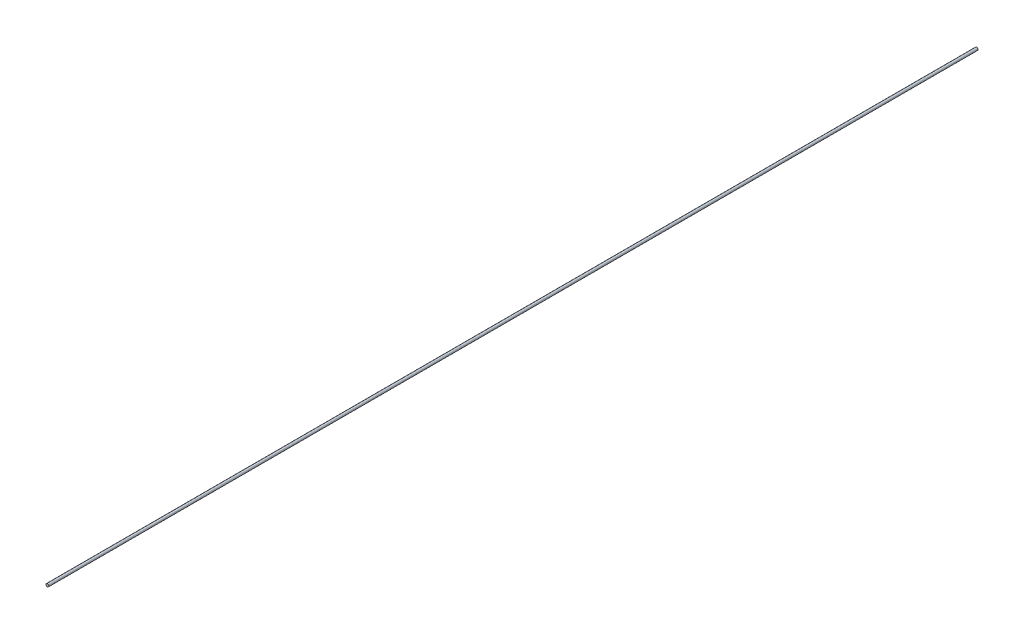
ISO-10303-21;
HEADER;
FILE_DESCRIPTION(('STEP AP214'),'2;1');
FILE_NAME('part.step','',(''),(''),'','','');
FILE_SCHEMA(('AUTOMOTIVE_DESIGN { 1 0 10303 214 1 1 1 1 }'));
ENDSEC;
DATA;
#1=APPLICATION_CONTEXT('core data for automotive mechanical design processes');
#2=APPLICATION_PROTOCOL_DEFINITION('international standard','automotive_design',2000,#1);
#3=PRODUCT_CONTEXT('',#1,'mechanical');
#4=PRODUCT('Part','Part','',(#3));
#5=PRODUCT_RELATED_PRODUCT_CATEGORY('part','',(#4));
#6=PRODUCT_DEFINITION_FORMATION('','',#4);
#7=PRODUCT_DEFINITION_CONTEXT('part definition',#1,'design');
#8=PRODUCT_DEFINITION('design','',#6,#7);
#9=PRODUCT_DEFINITION_SHAPE('','',#8);
#10=(LENGTH_UNIT() NAMED_UNIT(*) SI_UNIT(.MILLI.,.METRE.));
#11=(NAMED_UNIT(*) PLANE_ANGLE_UNIT() SI_UNIT($,.RADIAN.));
#12=(NAMED_UNIT(*) SI_UNIT($,.STERADIAN.) SOLID_ANGLE_UNIT());
#13=UNCERTAINTY_MEASURE_WITH_UNIT(LENGTH_MEASURE(1.E-05),#10,'distance_accuracy_value','');
#14=(GEOMETRIC_REPRESENTATION_CONTEXT(3) GLOBAL_UNCERTAINTY_ASSIGNED_CONTEXT((#13)) GLOBAL_UNIT_ASSIGNED_CONTEXT((#10,
#11,#12)) REPRESENTATION_CONTEXT('',''));
#15=CARTESIAN_POINT('',(0.,0.,0.));
#16=DIRECTION('',(0.,0.,1.));
#17=DIRECTION('',(1.,0.,0.));
#18=AXIS2_PLACEMENT_3D('',#15,#16,#17);
#19=CARTESIAN_POINT('',(0.,0.,1675.));
#20=DIRECTION('',(0.,0.,-1.));
#21=DIRECTION('',(-1.,0.,0.));
#22=AXIS2_PLACEMENT_3D('',#19,#20,#21);
#23=CYLINDRICAL_SURFACE('',#22,5.);
#24=CARTESIAN_POINT('',(0.,0.,1675.));
#25=DIRECTION('',(0.,0.,1.));
#26=DIRECTION('',(1.,0.,0.));
#27=AXIS2_PLACEMENT_3D('',#24,#25,#26);
#28=CIRCLE('',#27,5.);
#29=CARTESIAN_POINT('',(-5.,0.,1675.));
#30=VERTEX_POINT('',#29);
#31=EDGE_CURVE('E10',#30,#30,#28,.T.);
#32=CARTESIAN_POINT('',(0.,0.,-1675.));
#33=DIRECTION('',(0.,0.,1.));
#34=DIRECTION('',(1.,0.,0.));
#35=AXIS2_PLACEMENT_3D('',#32,#33,#34);
#36=CIRCLE('',#35,5.);
#37=CARTESIAN_POINT('',(-5.,0.,-1675.));
#38=VERTEX_POINT('',#37);
#39=EDGE_CURVE('E34',#38,#38,#36,.T.);
#40=CARTESIAN_POINT('',(-5.,0.,1675.));
#41=CARTESIAN_POINT('',(-5.,0.,1640.10416666667));
#42=CARTESIAN_POINT('',(-5.,0.,1605.20833333333));
#43=CARTESIAN_POINT('',(-5.,0.,1535.41666666667));
#44=CARTESIAN_POINT('',(-5.,0.,1500.52083333333));
#45=CARTESIAN_POINT('',(-5.,0.,1430.72916666667));
#46=CARTESIAN_POINT('',(-5.,0.,1395.83333333333));
#47=CARTESIAN_POINT('',(-5.,0.,1326.04166666667));
#48=CARTESIAN_POINT('',(-5.,0.,1291.14583333333));
#49=CARTESIAN_POINT('',(-5.,0.,1221.35416666667));
#50=CARTESIAN_POINT('',(-5.,0.,1186.45833333333));
#51=CARTESIAN_POINT('',(-5.,0.,1116.66666666667));
#52=CARTESIAN_POINT('',(-5.,0.,1081.77083333333));
#53=CARTESIAN_POINT('',(-5.,0.,1011.97916666667));
#54=CARTESIAN_POINT('',(-5.,0.,977.083333333333));
#55=CARTESIAN_POINT('',(-5.,0.,907.291666666667));
#56=CARTESIAN_POINT('',(-5.,0.,872.395833333333));
#57=CARTESIAN_POINT('',(-5.,0.,802.604166666667));
#58=CARTESIAN_POINT('',(-5.,0.,767.708333333333));
#59=CARTESIAN_POINT('',(-5.,0.,697.916666666667));
#60=CARTESIAN_POINT('',(-5.,0.,663.020833333333));
#61=CARTESIAN_POINT('',(-5.,0.,593.229166666667));
#62=CARTESIAN_POINT('',(-5.,0.,558.333333333333));
#63=CARTESIAN_POINT('',(-5.,0.,488.541666666667));
#64=CARTESIAN_POINT('',(-5.,0.,453.645833333333));
#65=CARTESIAN_POINT('',(-5.,0.,383.854166666667));
#66=CARTESIAN_POINT('',(-5.,0.,348.958333333333));
#67=CARTESIAN_POINT('',(-5.,0.,279.166666666667));
#68=CARTESIAN_POINT('',(-5.,0.,244.270833333333));
#69=CARTESIAN_POINT('',(-5.,0.,174.479166666667));
#70=CARTESIAN_POINT('',(-5.,0.,139.583333333333));
#71=CARTESIAN_POINT('',(-5.,0.,69.7916666666667));
#72=CARTESIAN_POINT('',(-5.,0.,34.8958333333333));
#73=CARTESIAN_POINT('',(-5.,0.,-34.8958333333333));
#74=CARTESIAN_POINT('',(-5.,0.,-69.7916666666667));
#75=CARTESIAN_POINT('',(-5.,0.,-139.583333333333));
#76=CARTESIAN_POINT('',(-5.,0.,-174.479166666667));
#77=CARTESIAN_POINT('',(-5.,0.,-244.270833333333));
#78=CARTESIAN_POINT('',(-5.,0.,-279.166666666667));
#79=CARTESIAN_POINT('',(-5.,0.,-348.958333333333));
#80=CARTESIAN_POINT('',(-5.,0.,-383.854166666667));
#81=CARTESIAN_POINT('',(-5.,0.,-453.645833333333));
#82=CARTESIAN_POINT('',(-5.,0.,-488.541666666666));
#83=CARTESIAN_POINT('',(-5.,0.,-558.333333333333));
#84=CARTESIAN_POINT('',(-5.,0.,-593.229166666667));
#85=CARTESIAN_POINT('',(-5.,0.,-663.020833333333));
#86=CARTESIAN_POINT('',(-5.,0.,-697.916666666667));
#87=CARTESIAN_POINT('',(-5.,0.,-767.708333333333));
#88=CARTESIAN_POINT('',(-5.,0.,-802.604166666666));
#89=CARTESIAN_POINT('',(-5.,0.,-872.395833333333));
#90=CARTESIAN_POINT('',(-5.,0.,-907.291666666667));
#91=CARTESIAN_POINT('',(-5.,0.,-977.083333333333));
#92=CARTESIAN_POINT('',(-5.,0.,-1011.97916666667));
#93=CARTESIAN_POINT('',(-5.,0.,-1081.77083333333));
#94=CARTESIAN_POINT('',(-5.,0.,-1116.66666666667));
#95=CARTESIAN_POINT('',(-5.,0.,-1186.45833333333));
#96=CARTESIAN_POINT('',(-5.,0.,-1221.35416666667));
#97=CARTESIAN_POINT('',(-5.,0.,-1291.14583333333));
#98=CARTESIAN_POINT('',(-5.,0.,-1326.04166666667));
#99=CARTESIAN_POINT('',(-5.,0.,-1395.83333333333));
#100=CARTESIAN_POINT('',(-5.,0.,-1430.72916666667));
#101=CARTESIAN_POINT('',(-5.,0.,-1500.52083333333));
#102=CARTESIAN_POINT('',(-5.,0.,-1535.41666666667));
#103=CARTESIAN_POINT('',(-5.,0.,-1605.20833333333));
#104=CARTESIAN_POINT('',(-5.,0.,-1640.10416666667));
#105=CARTESIAN_POINT('',(-5.,0.,-1675.));
#106=B_SPLINE_CURVE_WITH_KNOTS('',3,(#40,#41,#42,#43,#44,#45,#46,#47,#48,#49,#50,#51,#52,#53,
#54,#55,#56,#57,#58,#59,#60,#61,#62,#63,#64,#65,#66,#67,#68,#69,#70,#71,#72,#73,#74,#75,#76,#77,
#78,#79,#80,#81,#82,#83,#84,#85,#86,#87,#88,#89,#90,#91,#92,#93,#94,#95,#96,#97,#98,#99,#100,
#101,#102,#103,#104,#105),.UNSPECIFIED.,.F.,.F.,(4,2,2,2,2,2,2,2,2,2,2,2,2,2,2,2,2,2,2,2,2,2,2,
2,2,2,2,2,2,2,2,2,4),(0.,104.6875,209.375,314.0625,418.75,523.4375,628.125,732.8125,837.5,
942.1875,1046.875,1151.5625,1256.25,1360.9375,1465.625,1570.3125,1675.,1779.6875,1884.375,
1989.0625,2093.75,2198.4375,2303.125,2407.8125,2512.5,2617.1875,2721.875,2826.5625,2931.25,
3035.9375,3140.625,3245.3125,3350.),.UNSPECIFIED.);
#107=EDGE_CURVE('BSEAM31',#30,#38,#106,.T.);
#108=ORIENTED_EDGE('',*,*,#31,.F.);
#109=ORIENTED_EDGE('',*,*,#39,.T.);
#110=ORIENTED_EDGE('',*,*,#107,.T.);
#111=ORIENTED_EDGE('',*,*,#107,.F.);
#112=EDGE_LOOP('',(#108,#110,#109,#111));
#113=FACE_BOUND('',#112,.T.);
#114=ADVANCED_FACE('F31',(#113),#23,.T.);
#115=CARTESIAN_POINT('',(0.,0.,1675.));
#116=DIRECTION('',(0.,0.,1.));
#117=DIRECTION('',(1.,0.,0.));
#118=AXIS2_PLACEMENT_3D('',#115,#116,#117);
#119=PLANE('',#118);
#120=ORIENTED_EDGE('',*,*,#31,.T.);
#121=EDGE_LOOP('',(#120));
#122=FACE_BOUND('',#121,.T.);
#123=ADVANCED_FACE('F46',(#122),#119,.T.);
#124=CARTESIAN_POINT('',(0.,0.,-1675.));
#125=DIRECTION('',(0.,0.,1.));
#126=DIRECTION('',(1.,0.,0.));
#127=AXIS2_PLACEMENT_3D('',#124,#125,#126);
#128=PLANE('',#127);
#129=ORIENTED_EDGE('',*,*,#39,.F.);
#130=EDGE_LOOP('',(#129));
#131=FACE_BOUND('',#130,.T.);
#132=ADVANCED_FACE('F44',(#131),#128,.F.);
#133=CLOSED_SHELL('',(#114,#123,#132));
#134=MANIFOLD_SOLID_BREP('B2',#133);
#135=ADVANCED_BREP_SHAPE_REPRESENTATION('',(#18,#134),#14);
#136=SHAPE_DEFINITION_REPRESENTATION(#9,#135);
ENDSEC;
END-ISO-10303-21;
